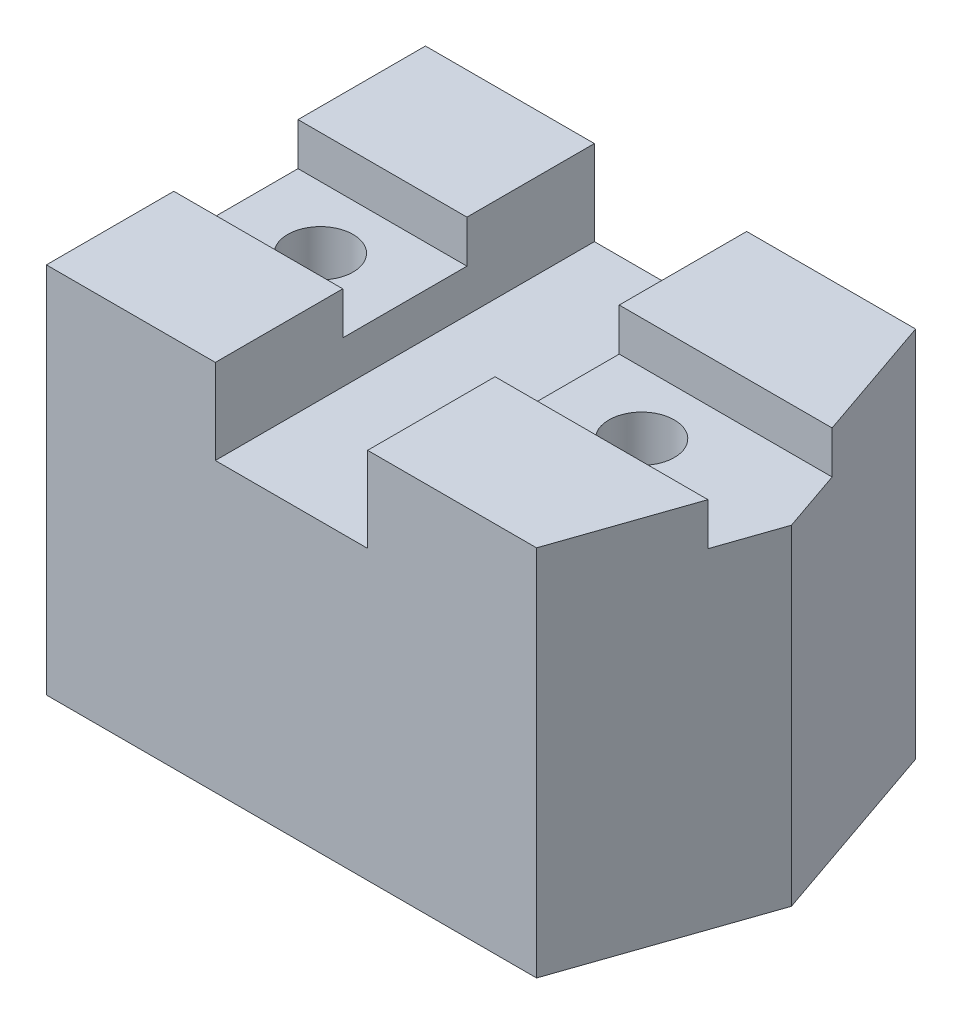
ISO-10303-21;
HEADER;
FILE_DESCRIPTION(('STEP AP214'),'2;1');
FILE_NAME('part.step','',(''),(''),'','','');
FILE_SCHEMA(('AUTOMOTIVE_DESIGN { 1 0 10303 214 1 1 1 1 }'));
ENDSEC;
DATA;
#1=APPLICATION_CONTEXT('core data for automotive mechanical design processes');
#2=APPLICATION_PROTOCOL_DEFINITION('international standard','automotive_design',2000,#1);
#3=PRODUCT_CONTEXT('',#1,'mechanical');
#4=PRODUCT('Part','Part','',(#3));
#5=PRODUCT_RELATED_PRODUCT_CATEGORY('part','',(#4));
#6=PRODUCT_DEFINITION_FORMATION('','',#4);
#7=PRODUCT_DEFINITION_CONTEXT('part definition',#1,'design');
#8=PRODUCT_DEFINITION('design','',#6,#7);
#9=PRODUCT_DEFINITION_SHAPE('','',#8);
#10=(LENGTH_UNIT() NAMED_UNIT(*) SI_UNIT(.MILLI.,.METRE.));
#11=(NAMED_UNIT(*) PLANE_ANGLE_UNIT() SI_UNIT($,.RADIAN.));
#12=(NAMED_UNIT(*) SI_UNIT($,.STERADIAN.) SOLID_ANGLE_UNIT());
#13=UNCERTAINTY_MEASURE_WITH_UNIT(LENGTH_MEASURE(1.E-05),#10,'distance_accuracy_value','');
#14=(GEOMETRIC_REPRESENTATION_CONTEXT(3) GLOBAL_UNCERTAINTY_ASSIGNED_CONTEXT((#13)) GLOBAL_UNIT_ASSIGNED_CONTEXT((#10,
#11,#12)) REPRESENTATION_CONTEXT('',''));
#15=CARTESIAN_POINT('',(0.,0.,0.));
#16=DIRECTION('',(0.,0.,1.));
#17=DIRECTION('',(1.,0.,0.));
#18=AXIS2_PLACEMENT_3D('',#15,#16,#17);
#19=CARTESIAN_POINT('',(0.,114.,0.));
#20=DIRECTION('',(0.,1.,0.));
#21=DIRECTION('',(0.,0.,1.));
#22=AXIS2_PLACEMENT_3D('',#19,#20,#21);
#23=PLANE('',#22);
#24=DIRECTION('',(0.,0.,1.));
#25=VECTOR('',#24,1.);
#26=CARTESIAN_POINT('',(-55.4560146083556,114.,58.));
#27=LINE('',#26,#25);
#28=CARTESIAN_POINT('',(-55.4560146083556,114.,19.));
#29=VERTEX_POINT('',#28);
#30=CARTESIAN_POINT('',(-55.4560146083556,114.,58.));
#31=VERTEX_POINT('',#30);
#32=EDGE_CURVE('E162',#29,#31,#27,.T.);
#33=ORIENTED_EDGE('',*,*,#32,.F.);
#34=DIRECTION('',(1.,0.,0.));
#35=VECTOR('',#34,1.);
#36=CARTESIAN_POINT('',(-107.155023459198,114.,19.));
#37=LINE('',#36,#35);
#38=CARTESIAN_POINT('',(-107.155023459198,114.,19.));
#39=VERTEX_POINT('',#38);
#40=EDGE_CURVE('E212',#39,#29,#37,.T.);
#41=ORIENTED_EDGE('',*,*,#40,.F.);
#42=DIRECTION('',(0.,0.,1.));
#43=VECTOR('',#42,1.);
#44=CARTESIAN_POINT('',(-107.155023459198,114.,58.));
#45=LINE('',#44,#43);
#46=CARTESIAN_POINT('',(-107.155023459198,114.,58.));
#47=VERTEX_POINT('',#46);
#48=EDGE_CURVE('E243',#39,#47,#45,.T.);
#49=ORIENTED_EDGE('',*,*,#48,.T.);
#50=DIRECTION('',(1.,0.,0.));
#51=VECTOR('',#50,1.);
#52=CARTESIAN_POINT('',(-107.155023459198,114.,58.));
#53=LINE('',#52,#51);
#54=EDGE_CURVE('E249',#47,#31,#53,.T.);
#55=ORIENTED_EDGE('',*,*,#54,.T.);
#56=EDGE_LOOP('',(#33,#41,#49,#55));
#57=FACE_BOUND('',#56,.T.);
#58=ADVANCED_FACE('F37',(#57),#23,.T.);
#59=CARTESIAN_POINT('',(-55.4560146083556,114.,-58.));
#60=VERTEX_POINT('',#59);
#61=CARTESIAN_POINT('',(-55.4560146083556,114.,-19.));
#62=VERTEX_POINT('',#61);
#63=EDGE_CURVE('E188',#60,#62,#27,.T.);
#64=ORIENTED_EDGE('',*,*,#63,.F.);
#65=DIRECTION('',(-1.,0.,0.));
#66=VECTOR('',#65,1.);
#67=CARTESIAN_POINT('',(-107.155023459198,114.,-58.));
#68=LINE('',#67,#66);
#69=CARTESIAN_POINT('',(-107.155023459198,114.,-58.));
#70=VERTEX_POINT('',#69);
#71=EDGE_CURVE('E244',#60,#70,#68,.T.);
#72=ORIENTED_EDGE('',*,*,#71,.T.);
#73=CARTESIAN_POINT('',(-107.155023459198,114.,-19.));
#74=VERTEX_POINT('',#73);
#75=EDGE_CURVE('E245',#70,#74,#45,.T.);
#76=ORIENTED_EDGE('',*,*,#75,.T.);
#77=DIRECTION('',(-1.,0.,0.));
#78=VECTOR('',#77,1.);
#79=CARTESIAN_POINT('',(-107.155023459198,114.,-19.));
#80=LINE('',#79,#78);
#81=EDGE_CURVE('E208',#62,#74,#80,.T.);
#82=ORIENTED_EDGE('',*,*,#81,.F.);
#83=EDGE_LOOP('',(#64,#72,#76,#82));
#84=FACE_BOUND('',#83,.T.);
#85=ADVANCED_FACE('F309',(#84),#23,.T.);
#86=CARTESIAN_POINT('',(-107.155023459198,101.,19.));
#87=DIRECTION('',(0.,0.,1.));
#88=DIRECTION('',(1.,0.,0.));
#89=AXIS2_PLACEMENT_3D('',#86,#87,#88);
#90=PLANE('',#89);
#91=ORIENTED_EDGE('',*,*,#40,.T.);
#92=DIRECTION('',(0.,-1.,0.));
#93=VECTOR('',#92,1.);
#94=CARTESIAN_POINT('',(-55.4560146083556,101.,19.));
#95=LINE('',#94,#93);
#96=CARTESIAN_POINT('',(-55.4560146083556,101.,19.));
#97=VERTEX_POINT('',#96);
#98=EDGE_CURVE('E205',#29,#97,#95,.T.);
#99=ORIENTED_EDGE('',*,*,#98,.T.);
#100=DIRECTION('',(1.,0.,0.));
#101=VECTOR('',#100,1.);
#102=CARTESIAN_POINT('',(-107.155023459198,101.,19.));
#103=LINE('',#102,#101);
#104=CARTESIAN_POINT('',(-107.155023459198,101.,19.));
#105=VERTEX_POINT('',#104);
#106=EDGE_CURVE('E222',#105,#97,#103,.T.);
#107=ORIENTED_EDGE('',*,*,#106,.F.);
#108=DIRECTION('',(0.,1.,0.));
#109=VECTOR('',#108,1.);
#110=CARTESIAN_POINT('',(-107.155023459198,101.,19.));
#111=LINE('',#110,#109);
#112=EDGE_CURVE('E234',#105,#39,#111,.T.);
#113=ORIENTED_EDGE('',*,*,#112,.T.);
#114=EDGE_LOOP('',(#91,#99,#107,#113));
#115=FACE_BOUND('',#114,.T.);
#116=ADVANCED_FACE('F324',(#115),#90,.F.);
#117=CARTESIAN_POINT('',(-107.155023459198,101.,-19.));
#118=DIRECTION('',(0.,0.,-1.));
#119=DIRECTION('',(-1.,0.,0.));
#120=AXIS2_PLACEMENT_3D('',#117,#118,#119);
#121=PLANE('',#120);
#122=DIRECTION('',(-1.,0.,0.));
#123=VECTOR('',#122,1.);
#124=CARTESIAN_POINT('',(-107.155023459198,101.,-19.));
#125=LINE('',#124,#123);
#126=CARTESIAN_POINT('',(-55.4560146083556,101.,-19.));
#127=VERTEX_POINT('',#126);
#128=CARTESIAN_POINT('',(-107.155023459198,101.,-19.));
#129=VERTEX_POINT('',#128);
#130=EDGE_CURVE('E215',#127,#129,#125,.T.);
#131=ORIENTED_EDGE('',*,*,#130,.F.);
#132=DIRECTION('',(0.,1.,0.));
#133=VECTOR('',#132,1.);
#134=CARTESIAN_POINT('',(-55.4560146083556,101.,-19.));
#135=LINE('',#134,#133);
#136=EDGE_CURVE('E202',#127,#62,#135,.T.);
#137=ORIENTED_EDGE('',*,*,#136,.T.);
#138=ORIENTED_EDGE('',*,*,#81,.T.);
#139=DIRECTION('',(0.,1.,0.));
#140=VECTOR('',#139,1.);
#141=CARTESIAN_POINT('',(-107.155023459198,101.,-19.));
#142=LINE('',#141,#140);
#143=EDGE_CURVE('E236',#129,#74,#142,.T.);
#144=ORIENTED_EDGE('',*,*,#143,.F.);
#145=EDGE_LOOP('',(#131,#137,#138,#144));
#146=FACE_BOUND('',#145,.T.);
#147=ADVANCED_FACE('F314',(#146),#121,.F.);
#148=CARTESIAN_POINT('',(0.,101.,0.));
#149=DIRECTION('',(0.,-1.,0.));
#150=DIRECTION('',(0.,0.,-1.));
#151=AXIS2_PLACEMENT_3D('',#148,#149,#150);
#152=PLANE('',#151);
#153=CARTESIAN_POINT('',(-81.3055190337768,101.,0.));
#154=DIRECTION('',(0.,1.,0.));
#155=DIRECTION('',(0.,0.,1.));
#156=AXIS2_PLACEMENT_3D('',#153,#154,#155);
#157=CIRCLE('',#156,9.99999999999999);
#158=CARTESIAN_POINT('',(-81.3055190337768,101.,10.));
#159=VERTEX_POINT('',#158);
#160=EDGE_CURVE('E329',#159,#159,#157,.T.);
#161=ORIENTED_EDGE('',*,*,#160,.F.);
#162=EDGE_LOOP('',(#161));
#163=FACE_BOUND('',#162,.T.);
#164=ORIENTED_EDGE('',*,*,#106,.T.);
#165=DIRECTION('',(0.,0.,-1.));
#166=VECTOR('',#165,1.);
#167=CARTESIAN_POINT('',(-55.4560146083556,101.,0.));
#168=LINE('',#167,#166);
#169=EDGE_CURVE('E11',#97,#127,#168,.T.);
#170=ORIENTED_EDGE('',*,*,#169,.T.);
#171=ORIENTED_EDGE('',*,*,#130,.T.);
#172=DIRECTION('',(0.,0.,1.));
#173=VECTOR('',#172,1.);
#174=CARTESIAN_POINT('',(-107.155023459198,101.,19.));
#175=LINE('',#174,#173);
#176=EDGE_CURVE('E219',#129,#105,#175,.T.);
#177=ORIENTED_EDGE('',*,*,#176,.T.);
#178=EDGE_LOOP('',(#164,#170,#171,#177));
#179=FACE_BOUND('',#178,.T.);
#180=ADVANCED_FACE('F322',(#163,#179),#152,.F.);
#181=DIRECTION('',(0.,0.,-1.));
#182=VECTOR('',#181,1.);
#183=CARTESIAN_POINT('',(-8.85403231004034,114.,58.));
#184=LINE('',#183,#182);
#185=CARTESIAN_POINT('',(-8.85403231004034,114.,58.));
#186=VERTEX_POINT('',#185);
#187=CARTESIAN_POINT('',(-8.85403231004034,114.,19.));
#188=VERTEX_POINT('',#187);
#189=EDGE_CURVE('E178',#186,#188,#184,.T.);
#190=ORIENTED_EDGE('',*,*,#189,.F.);
#191=CARTESIAN_POINT('',(42.844976540802,114.,58.));
#192=VERTEX_POINT('',#191);
#193=EDGE_CURVE('E248',#186,#192,#53,.T.);
#194=ORIENTED_EDGE('',*,*,#193,.T.);
#195=DIRECTION('',(0.325990683319404,0.,-0.945372981626272));
#196=VECTOR('',#195,1.);
#197=CARTESIAN_POINT('',(42.844976540802,114.,58.));
#198=LINE('',#197,#196);
#199=CARTESIAN_POINT('',(56.293252402871,114.,19.));
#200=VERTEX_POINT('',#199);
#201=EDGE_CURVE('E251',#192,#200,#198,.T.);
#202=ORIENTED_EDGE('',*,*,#201,.T.);
#203=EDGE_CURVE('E227',#188,#200,#37,.T.);
#204=ORIENTED_EDGE('',*,*,#203,.F.);
#205=EDGE_LOOP('',(#190,#194,#202,#204));
#206=FACE_BOUND('',#205,.T.);
#207=ADVANCED_FACE('F362',(#206),#23,.T.);
#208=CARTESIAN_POINT('',(-107.155023459198,114.,-58.));
#209=DIRECTION('',(0.,0.,1.));
#210=DIRECTION('',(1.,0.,0.));
#211=AXIS2_PLACEMENT_3D('',#208,#209,#210);
#212=PLANE('',#211);
#213=ORIENTED_EDGE('',*,*,#71,.F.);
#214=DIRECTION('',(0.,1.,0.));
#215=VECTOR('',#214,1.);
#216=CARTESIAN_POINT('',(-55.4560146083556,88.,-58.));
#217=LINE('',#216,#215);
#218=CARTESIAN_POINT('',(-55.4560146083556,88.,-58.));
#219=VERTEX_POINT('',#218);
#220=EDGE_CURVE('E192',#219,#60,#217,.T.);
#221=ORIENTED_EDGE('',*,*,#220,.F.);
#222=DIRECTION('',(-1.,0.,0.));
#223=VECTOR('',#222,1.);
#224=CARTESIAN_POINT('',(-8.85403231004034,88.,-58.));
#225=LINE('',#224,#223);
#226=CARTESIAN_POINT('',(-8.85403231004034,88.,-58.));
#227=VERTEX_POINT('',#226);
#228=EDGE_CURVE('E168',#227,#219,#225,.T.);
#229=ORIENTED_EDGE('',*,*,#228,.F.);
#230=DIRECTION('',(0.,1.,0.));
#231=VECTOR('',#230,1.);
#232=CARTESIAN_POINT('',(-8.85403231004034,88.,-58.));
#233=LINE('',#232,#231);
#234=CARTESIAN_POINT('',(-8.85403231004034,114.,-58.));
#235=VERTEX_POINT('',#234);
#236=EDGE_CURVE('E195',#227,#235,#233,.T.);
#237=ORIENTED_EDGE('',*,*,#236,.T.);
#238=CARTESIAN_POINT('',(42.844976540802,114.,-58.));
#239=VERTEX_POINT('',#238);
#240=EDGE_CURVE('E240',#239,#235,#68,.T.);
#241=ORIENTED_EDGE('',*,*,#240,.F.);
#242=DIRECTION('',(0.,-1.,0.));
#243=VECTOR('',#242,1.);
#244=CARTESIAN_POINT('',(42.844976540802,114.,-58.));
#245=LINE('',#244,#243);
#246=CARTESIAN_POINT('',(42.844976540802,0.,-58.));
#247=VERTEX_POINT('',#246);
#248=EDGE_CURVE('E256',#239,#247,#245,.T.);
#249=ORIENTED_EDGE('',*,*,#248,.T.);
#250=DIRECTION('',(-1.,0.,0.));
#251=VECTOR('',#250,1.);
#252=CARTESIAN_POINT('',(-107.155023459198,0.,-58.));
#253=LINE('',#252,#251);
#254=CARTESIAN_POINT('',(-107.155023459198,0.,-58.));
#255=VERTEX_POINT('',#254);
#256=EDGE_CURVE('E233',#247,#255,#253,.T.);
#257=ORIENTED_EDGE('',*,*,#256,.T.);
#258=DIRECTION('',(0.,-1.,0.));
#259=VECTOR('',#258,1.);
#260=CARTESIAN_POINT('',(-107.155023459198,114.,-58.));
#261=LINE('',#260,#259);
#262=EDGE_CURVE('E278',#70,#255,#261,.T.);
#263=ORIENTED_EDGE('',*,*,#262,.F.);
#264=EDGE_LOOP('',(#213,#221,#229,#237,#241,#249,#257,#263));
#265=FACE_BOUND('',#264,.T.);
#266=ADVANCED_FACE('F39',(#265),#212,.F.);
#267=CARTESIAN_POINT('',(-107.155023459198,114.,58.));
#268=DIRECTION('',(1.,0.,0.));
#269=DIRECTION('',(0.,0.,-1.));
#270=AXIS2_PLACEMENT_3D('',#267,#268,#269);
#271=PLANE('',#270);
#272=ORIENTED_EDGE('',*,*,#48,.F.);
#273=ORIENTED_EDGE('',*,*,#112,.F.);
#274=ORIENTED_EDGE('',*,*,#176,.F.);
#275=ORIENTED_EDGE('',*,*,#143,.T.);
#276=ORIENTED_EDGE('',*,*,#75,.F.);
#277=ORIENTED_EDGE('',*,*,#262,.T.);
#278=DIRECTION('',(0.,0.,1.));
#279=VECTOR('',#278,1.);
#280=CARTESIAN_POINT('',(-107.155023459198,0.,58.));
#281=LINE('',#280,#279);
#282=CARTESIAN_POINT('',(-107.155023459198,0.,58.));
#283=VERTEX_POINT('',#282);
#284=EDGE_CURVE('E259',#255,#283,#281,.T.);
#285=ORIENTED_EDGE('',*,*,#284,.T.);
#286=DIRECTION('',(0.,-1.,0.));
#287=VECTOR('',#286,1.);
#288=CARTESIAN_POINT('',(-107.155023459198,114.,58.));
#289=LINE('',#288,#287);
#290=EDGE_CURVE('E275',#47,#283,#289,.T.);
#291=ORIENTED_EDGE('',*,*,#290,.F.);
#292=EDGE_LOOP('',(#272,#273,#274,#275,#276,#277,#285,#291));
#293=FACE_BOUND('',#292,.T.);
#294=ADVANCED_FACE('F318',(#293),#271,.F.);
#295=CARTESIAN_POINT('',(-107.155023459198,114.,58.));
#296=DIRECTION('',(0.,0.,-1.));
#297=DIRECTION('',(-1.,0.,0.));
#298=AXIS2_PLACEMENT_3D('',#295,#296,#297);
#299=PLANE('',#298);
#300=DIRECTION('',(1.,0.,0.));
#301=VECTOR('',#300,1.);
#302=CARTESIAN_POINT('',(-55.4560146083556,88.,58.));
#303=LINE('',#302,#301);
#304=CARTESIAN_POINT('',(-55.4560146083556,88.,58.));
#305=VERTEX_POINT('',#304);
#306=CARTESIAN_POINT('',(-8.85403231004034,88.,58.));
#307=VERTEX_POINT('',#306);
#308=EDGE_CURVE('E174',#305,#307,#303,.T.);
#309=ORIENTED_EDGE('',*,*,#308,.F.);
#310=DIRECTION('',(0.,1.,0.));
#311=VECTOR('',#310,1.);
#312=CARTESIAN_POINT('',(-55.4560146083556,88.,58.));
#313=LINE('',#312,#311);
#314=EDGE_CURVE('E156',#305,#31,#313,.T.);
#315=ORIENTED_EDGE('',*,*,#314,.T.);
#316=ORIENTED_EDGE('',*,*,#54,.F.);
#317=ORIENTED_EDGE('',*,*,#290,.T.);
#318=DIRECTION('',(1.,0.,0.));
#319=VECTOR('',#318,1.);
#320=CARTESIAN_POINT('',(-107.155023459198,0.,58.));
#321=LINE('',#320,#319);
#322=CARTESIAN_POINT('',(42.844976540802,0.,58.));
#323=VERTEX_POINT('',#322);
#324=EDGE_CURVE('E261',#283,#323,#321,.T.);
#325=ORIENTED_EDGE('',*,*,#324,.T.);
#326=DIRECTION('',(0.,-1.,0.));
#327=VECTOR('',#326,1.);
#328=CARTESIAN_POINT('',(42.844976540802,114.,58.));
#329=LINE('',#328,#327);
#330=EDGE_CURVE('E272',#192,#323,#329,.T.);
#331=ORIENTED_EDGE('',*,*,#330,.F.);
#332=ORIENTED_EDGE('',*,*,#193,.F.);
#333=DIRECTION('',(0.,1.,0.));
#334=VECTOR('',#333,1.);
#335=CARTESIAN_POINT('',(-8.85403231004034,88.,58.));
#336=LINE('',#335,#334);
#337=EDGE_CURVE('E167',#307,#186,#336,.T.);
#338=ORIENTED_EDGE('',*,*,#337,.F.);
#339=EDGE_LOOP('',(#309,#315,#316,#317,#325,#331,#332,#338));
#340=FACE_BOUND('',#339,.T.);
#341=ADVANCED_FACE('F180',(#340),#299,.F.);
#342=CARTESIAN_POINT('',(42.844976540802,114.,58.));
#343=DIRECTION('',(-0.945372981626272,0.,-0.325990683319404));
#344=DIRECTION('',(-0.325990683319404,0.,0.945372981626272));
#345=AXIS2_PLACEMENT_3D('',#342,#343,#344);
#346=PLANE('',#345);
#347=DIRECTION('',(0.325990683319403,0.,-0.945372981626272));
#348=VECTOR('',#347,1.);
#349=CARTESIAN_POINT('',(56.293252402871,101.,19.));
#350=LINE('',#349,#348);
#351=CARTESIAN_POINT('',(56.293252402871,101.,19.));
#352=VERTEX_POINT('',#351);
#353=CARTESIAN_POINT('',(62.844976540802,101.,0.));
#354=VERTEX_POINT('',#353);
#355=EDGE_CURVE('E209',#352,#354,#350,.T.);
#356=ORIENTED_EDGE('',*,*,#355,.F.);
#357=DIRECTION('',(0.,1.,0.));
#358=VECTOR('',#357,1.);
#359=CARTESIAN_POINT('',(56.293252402871,101.,19.));
#360=LINE('',#359,#358);
#361=EDGE_CURVE('E230',#352,#200,#360,.T.);
#362=ORIENTED_EDGE('',*,*,#361,.T.);
#363=ORIENTED_EDGE('',*,*,#201,.F.);
#364=ORIENTED_EDGE('',*,*,#330,.T.);
#365=DIRECTION('',(0.325990683319404,0.,-0.945372981626272));
#366=VECTOR('',#365,1.);
#367=CARTESIAN_POINT('',(42.844976540802,0.,58.));
#368=LINE('',#367,#366);
#369=CARTESIAN_POINT('',(62.844976540802,0.,0.));
#370=VERTEX_POINT('',#369);
#371=EDGE_CURVE('E263',#323,#370,#368,.T.);
#372=ORIENTED_EDGE('',*,*,#371,.T.);
#373=DIRECTION('',(0.,-1.,0.));
#374=VECTOR('',#373,1.);
#375=CARTESIAN_POINT('',(62.844976540802,114.,0.));
#376=LINE('',#375,#374);
#377=EDGE_CURVE('E270',#354,#370,#376,.T.);
#378=ORIENTED_EDGE('',*,*,#377,.F.);
#379=EDGE_LOOP('',(#356,#362,#363,#364,#372,#378));
#380=FACE_BOUND('',#379,.T.);
#381=ADVANCED_FACE('F291',(#380),#346,.F.);
#382=CARTESIAN_POINT('',(42.844976540802,114.,-58.));
#383=DIRECTION('',(-0.945372981626272,0.,0.325990683319404));
#384=DIRECTION('',(0.325990683319404,0.,0.945372981626272));
#385=AXIS2_PLACEMENT_3D('',#382,#383,#384);
#386=PLANE('',#385);
#387=DIRECTION('',(-0.325990683319404,0.,-0.945372981626272));
#388=VECTOR('',#387,1.);
#389=CARTESIAN_POINT('',(42.844976540802,114.,-58.));
#390=LINE('',#389,#388);
#391=CARTESIAN_POINT('',(56.293252402871,114.,-19.));
#392=VERTEX_POINT('',#391);
#393=EDGE_CURVE('E254',#392,#239,#390,.T.);
#394=ORIENTED_EDGE('',*,*,#393,.F.);
#395=DIRECTION('',(0.,1.,0.));
#396=VECTOR('',#395,1.);
#397=CARTESIAN_POINT('',(56.293252402871,101.,-19.));
#398=LINE('',#397,#396);
#399=CARTESIAN_POINT('',(56.293252402871,101.,-19.));
#400=VERTEX_POINT('',#399);
#401=EDGE_CURVE('E60',#400,#392,#398,.T.);
#402=ORIENTED_EDGE('',*,*,#401,.F.);
#403=DIRECTION('',(-0.325990683319404,0.,-0.945372981626272));
#404=VECTOR('',#403,1.);
#405=CARTESIAN_POINT('',(56.293252402871,101.,-19.));
#406=LINE('',#405,#404);
#407=EDGE_CURVE('E211',#354,#400,#406,.T.);
#408=ORIENTED_EDGE('',*,*,#407,.F.);
#409=ORIENTED_EDGE('',*,*,#377,.T.);
#410=DIRECTION('',(-0.325990683319404,0.,-0.945372981626272));
#411=VECTOR('',#410,1.);
#412=CARTESIAN_POINT('',(42.844976540802,0.,-58.));
#413=LINE('',#412,#411);
#414=EDGE_CURVE('E266',#370,#247,#413,.T.);
#415=ORIENTED_EDGE('',*,*,#414,.T.);
#416=ORIENTED_EDGE('',*,*,#248,.F.);
#417=EDGE_LOOP('',(#394,#402,#408,#409,#415,#416));
#418=FACE_BOUND('',#417,.T.);
#419=ADVANCED_FACE('F295',(#418),#386,.F.);
#420=CARTESIAN_POINT('',(-8.85403231004034,114.,-19.));
#421=VERTEX_POINT('',#420);
#422=EDGE_CURVE('E190',#421,#235,#184,.T.);
#423=ORIENTED_EDGE('',*,*,#422,.F.);
#424=EDGE_CURVE('E225',#392,#421,#80,.T.);
#425=ORIENTED_EDGE('',*,*,#424,.F.);
#426=ORIENTED_EDGE('',*,*,#393,.T.);
#427=ORIENTED_EDGE('',*,*,#240,.T.);
#428=EDGE_LOOP('',(#423,#425,#426,#427));
#429=FACE_BOUND('',#428,.T.);
#430=ADVANCED_FACE('F300',(#429),#23,.T.);
#431=CARTESIAN_POINT('',(0.,0.,0.));
#432=DIRECTION('',(0.,1.,0.));
#433=DIRECTION('',(0.,0.,1.));
#434=AXIS2_PLACEMENT_3D('',#431,#432,#433);
#435=PLANE('',#434);
#436=CARTESIAN_POINT('',(-81.3055190337768,0.,0.));
#437=DIRECTION('',(0.,1.,0.));
#438=DIRECTION('',(0.,0.,1.));
#439=AXIS2_PLACEMENT_3D('',#436,#437,#438);
#440=CIRCLE('',#439,9.99999999999999);
#441=CARTESIAN_POINT('',(-81.3055190337768,0.,10.));
#442=VERTEX_POINT('',#441);
#443=EDGE_CURVE('E327',#442,#442,#440,.T.);
#444=ORIENTED_EDGE('',*,*,#443,.T.);
#445=EDGE_LOOP('',(#444));
#446=FACE_BOUND('',#445,.T.);
#447=CARTESIAN_POINT('',(16.9954721153808,0.,0.));
#448=DIRECTION('',(0.,1.,0.));
#449=DIRECTION('',(0.,0.,-1.));
#450=AXIS2_PLACEMENT_3D('',#447,#448,#449);
#451=CIRCLE('',#450,9.99999999999999);
#452=CARTESIAN_POINT('',(16.9954721153808,0.,-9.99999999999998));
#453=VERTEX_POINT('',#452);
#454=EDGE_CURVE('E338',#453,#453,#451,.T.);
#455=ORIENTED_EDGE('',*,*,#454,.T.);
#456=EDGE_LOOP('',(#455));
#457=FACE_BOUND('',#456,.T.);
#458=ORIENTED_EDGE('',*,*,#256,.F.);
#459=ORIENTED_EDGE('',*,*,#414,.F.);
#460=ORIENTED_EDGE('',*,*,#371,.F.);
#461=ORIENTED_EDGE('',*,*,#324,.F.);
#462=ORIENTED_EDGE('',*,*,#284,.F.);
#463=EDGE_LOOP('',(#458,#459,#460,#461,#462));
#464=FACE_BOUND('',#463,.T.);
#465=ADVANCED_FACE('F342',(#446,#457,#464),#435,.F.);
#466=CARTESIAN_POINT('',(-8.85403231004034,101.,19.));
#467=VERTEX_POINT('',#466);
#468=EDGE_CURVE('E221',#467,#352,#103,.T.);
#469=ORIENTED_EDGE('',*,*,#468,.F.);
#470=DIRECTION('',(0.,1.,0.));
#471=VECTOR('',#470,1.);
#472=CARTESIAN_POINT('',(-8.85403231004034,101.,19.));
#473=LINE('',#472,#471);
#474=EDGE_CURVE('E52',#467,#188,#473,.T.);
#475=ORIENTED_EDGE('',*,*,#474,.T.);
#476=ORIENTED_EDGE('',*,*,#203,.T.);
#477=ORIENTED_EDGE('',*,*,#361,.F.);
#478=EDGE_LOOP('',(#469,#475,#476,#477));
#479=FACE_BOUND('',#478,.T.);
#480=ADVANCED_FACE('F285',(#479),#90,.F.);
#481=ORIENTED_EDGE('',*,*,#424,.T.);
#482=DIRECTION('',(0.,-1.,0.));
#483=VECTOR('',#482,1.);
#484=CARTESIAN_POINT('',(-8.85403231004034,101.,-19.));
#485=LINE('',#484,#483);
#486=CARTESIAN_POINT('',(-8.85403231004034,101.,-19.));
#487=VERTEX_POINT('',#486);
#488=EDGE_CURVE('E194',#421,#487,#485,.T.);
#489=ORIENTED_EDGE('',*,*,#488,.T.);
#490=EDGE_CURVE('E216',#400,#487,#125,.T.);
#491=ORIENTED_EDGE('',*,*,#490,.F.);
#492=ORIENTED_EDGE('',*,*,#401,.T.);
#493=EDGE_LOOP('',(#481,#489,#491,#492));
#494=FACE_BOUND('',#493,.T.);
#495=ADVANCED_FACE('F301',(#494),#121,.F.);
#496=CARTESIAN_POINT('',(16.9954721153808,101.,0.));
#497=DIRECTION('',(0.,1.,0.));
#498=DIRECTION('',(0.,0.,-1.));
#499=AXIS2_PLACEMENT_3D('',#496,#497,#498);
#500=CIRCLE('',#499,9.99999999999999);
#501=CARTESIAN_POINT('',(16.9954721153808,101.,-9.99999999999998));
#502=VERTEX_POINT('',#501);
#503=EDGE_CURVE('E334',#502,#502,#500,.T.);
#504=ORIENTED_EDGE('',*,*,#503,.F.);
#505=EDGE_LOOP('',(#504));
#506=FACE_BOUND('',#505,.T.);
#507=ORIENTED_EDGE('',*,*,#490,.T.);
#508=DIRECTION('',(0.,0.,1.));
#509=VECTOR('',#508,1.);
#510=CARTESIAN_POINT('',(-8.85403231004034,101.,0.));
#511=LINE('',#510,#509);
#512=EDGE_CURVE('E45',#487,#467,#511,.T.);
#513=ORIENTED_EDGE('',*,*,#512,.T.);
#514=ORIENTED_EDGE('',*,*,#468,.T.);
#515=ORIENTED_EDGE('',*,*,#355,.T.);
#516=ORIENTED_EDGE('',*,*,#407,.T.);
#517=EDGE_LOOP('',(#507,#513,#514,#515,#516));
#518=FACE_BOUND('',#517,.T.);
#519=ADVANCED_FACE('F282',(#506,#518),#152,.F.);
#520=CARTESIAN_POINT('',(-55.4560146083556,88.,58.));
#521=DIRECTION('',(-1.,0.,0.));
#522=DIRECTION('',(0.,0.,1.));
#523=AXIS2_PLACEMENT_3D('',#520,#521,#522);
#524=PLANE('',#523);
#525=ORIENTED_EDGE('',*,*,#32,.T.);
#526=ORIENTED_EDGE('',*,*,#314,.F.);
#527=DIRECTION('',(0.,0.,1.));
#528=VECTOR('',#527,1.);
#529=CARTESIAN_POINT('',(-55.4560146083556,88.,58.));
#530=LINE('',#529,#528);
#531=EDGE_CURVE('E159',#219,#305,#530,.T.);
#532=ORIENTED_EDGE('',*,*,#531,.F.);
#533=ORIENTED_EDGE('',*,*,#220,.T.);
#534=ORIENTED_EDGE('',*,*,#63,.T.);
#535=ORIENTED_EDGE('',*,*,#136,.F.);
#536=ORIENTED_EDGE('',*,*,#169,.F.);
#537=ORIENTED_EDGE('',*,*,#98,.F.);
#538=EDGE_LOOP('',(#525,#526,#532,#533,#534,#535,#536,#537));
#539=FACE_BOUND('',#538,.T.);
#540=ADVANCED_FACE('F158',(#539),#524,.F.);
#541=CARTESIAN_POINT('',(-8.85403231004034,88.,58.));
#542=DIRECTION('',(1.,0.,0.));
#543=DIRECTION('',(0.,0.,-1.));
#544=AXIS2_PLACEMENT_3D('',#541,#542,#543);
#545=PLANE('',#544);
#546=ORIENTED_EDGE('',*,*,#512,.F.);
#547=ORIENTED_EDGE('',*,*,#488,.F.);
#548=ORIENTED_EDGE('',*,*,#422,.T.);
#549=ORIENTED_EDGE('',*,*,#236,.F.);
#550=DIRECTION('',(0.,0.,-1.));
#551=VECTOR('',#550,1.);
#552=CARTESIAN_POINT('',(-8.85403231004034,88.,58.));
#553=LINE('',#552,#551);
#554=EDGE_CURVE('E182',#307,#227,#553,.T.);
#555=ORIENTED_EDGE('',*,*,#554,.F.);
#556=ORIENTED_EDGE('',*,*,#337,.T.);
#557=ORIENTED_EDGE('',*,*,#189,.T.);
#558=ORIENTED_EDGE('',*,*,#474,.F.);
#559=EDGE_LOOP('',(#546,#547,#548,#549,#555,#556,#557,#558));
#560=FACE_BOUND('',#559,.T.);
#561=ADVANCED_FACE('F302',(#560),#545,.F.);
#562=CARTESIAN_POINT('',(0.,88.,0.));
#563=DIRECTION('',(0.,1.,0.));
#564=DIRECTION('',(0.,0.,1.));
#565=AXIS2_PLACEMENT_3D('',#562,#563,#564);
#566=PLANE('',#565);
#567=ORIENTED_EDGE('',*,*,#531,.T.);
#568=ORIENTED_EDGE('',*,*,#308,.T.);
#569=ORIENTED_EDGE('',*,*,#554,.T.);
#570=ORIENTED_EDGE('',*,*,#228,.T.);
#571=EDGE_LOOP('',(#567,#568,#569,#570));
#572=FACE_BOUND('',#571,.T.);
#573=ADVANCED_FACE('F172',(#572),#566,.T.);
#574=CARTESIAN_POINT('',(16.9954721153808,0.,0.));
#575=DIRECTION('',(0.,1.,0.));
#576=DIRECTION('',(0.,0.,1.));
#577=AXIS2_PLACEMENT_3D('',#574,#575,#576);
#578=CYLINDRICAL_SURFACE('',#577,9.99999999999999);
#579=ORIENTED_EDGE('',*,*,#454,.F.);
#580=EDGE_LOOP('',(#579));
#581=FACE_BOUND('',#580,.T.);
#582=ORIENTED_EDGE('',*,*,#503,.T.);
#583=EDGE_LOOP('',(#582));
#584=FACE_BOUND('',#583,.T.);
#585=ADVANCED_FACE('F345',(#581,#584),#578,.F.);
#586=CARTESIAN_POINT('',(-81.3055190337768,0.,0.));
#587=DIRECTION('',(0.,1.,0.));
#588=DIRECTION('',(0.,0.,1.));
#589=AXIS2_PLACEMENT_3D('',#586,#587,#588);
#590=CYLINDRICAL_SURFACE('',#589,9.99999999999999);
#591=ORIENTED_EDGE('',*,*,#443,.F.);
#592=EDGE_LOOP('',(#591));
#593=FACE_BOUND('',#592,.T.);
#594=ORIENTED_EDGE('',*,*,#160,.T.);
#595=EDGE_LOOP('',(#594));
#596=FACE_BOUND('',#595,.T.);
#597=ADVANCED_FACE('F348',(#593,#596),#590,.F.);
#598=CLOSED_SHELL('',(#58,#85,#116,#147,#180,#207,#266,#294,#341,#381,#419,#430,#465,#480,#495,
#519,#540,#561,#573,#585,#597));
#599=MANIFOLD_SOLID_BREP('B2',#598);
#600=ADVANCED_BREP_SHAPE_REPRESENTATION('',(#18,#599),#14);
#601=SHAPE_DEFINITION_REPRESENTATION(#9,#600);
ENDSEC;
END-ISO-10303-21;
